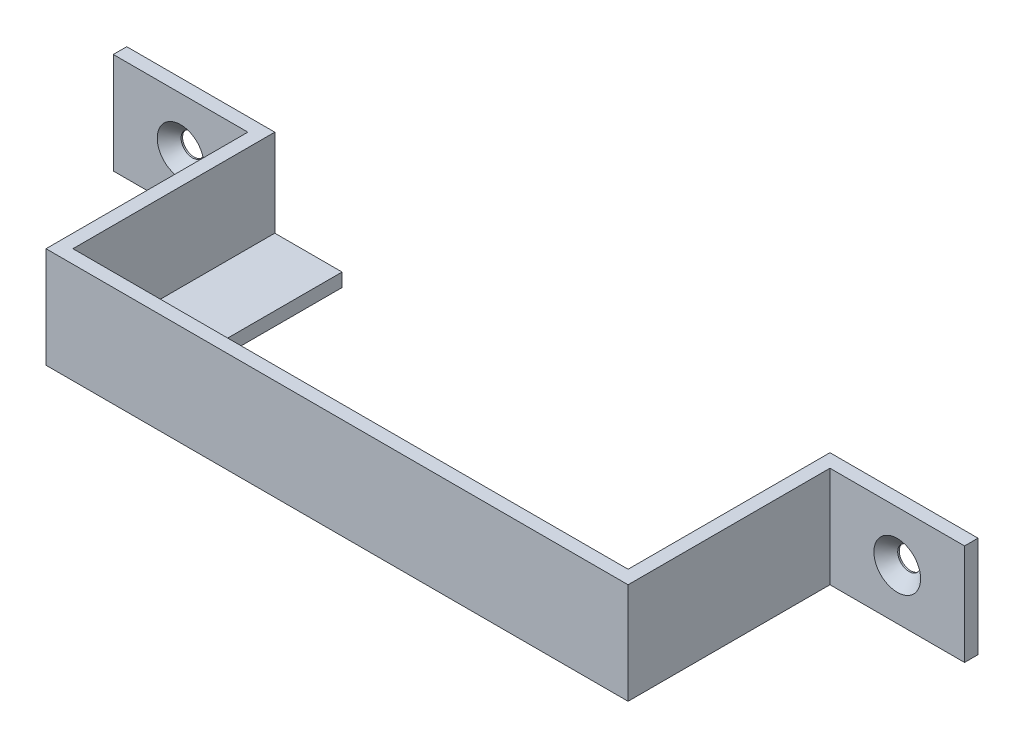
ISO-10303-21;
HEADER;
FILE_DESCRIPTION(('STEP AP214'),'2;1');
FILE_NAME('part.step','',(''),(''),'','','');
FILE_SCHEMA(('AUTOMOTIVE_DESIGN { 1 0 10303 214 1 1 1 1 }'));
ENDSEC;
DATA;
#1=APPLICATION_CONTEXT('core data for automotive mechanical design processes');
#2=APPLICATION_PROTOCOL_DEFINITION('international standard','automotive_design',2000,#1);
#3=PRODUCT_CONTEXT('',#1,'mechanical');
#4=PRODUCT('Part','Part','',(#3));
#5=PRODUCT_RELATED_PRODUCT_CATEGORY('part','',(#4));
#6=PRODUCT_DEFINITION_FORMATION('','',#4);
#7=PRODUCT_DEFINITION_CONTEXT('part definition',#1,'design');
#8=PRODUCT_DEFINITION('design','',#6,#7);
#9=PRODUCT_DEFINITION_SHAPE('','',#8);
#10=(LENGTH_UNIT() NAMED_UNIT(*) SI_UNIT(.MILLI.,.METRE.));
#11=(NAMED_UNIT(*) PLANE_ANGLE_UNIT() SI_UNIT($,.RADIAN.));
#12=(NAMED_UNIT(*) SI_UNIT($,.STERADIAN.) SOLID_ANGLE_UNIT());
#13=UNCERTAINTY_MEASURE_WITH_UNIT(LENGTH_MEASURE(1.E-05),#10,'distance_accuracy_value','');
#14=(GEOMETRIC_REPRESENTATION_CONTEXT(3) GLOBAL_UNCERTAINTY_ASSIGNED_CONTEXT((#13)) GLOBAL_UNIT_ASSIGNED_CONTEXT((#10,
#11,#12)) REPRESENTATION_CONTEXT('',''));
#15=CARTESIAN_POINT('',(0.,0.,0.));
#16=DIRECTION('',(0.,0.,1.));
#17=DIRECTION('',(1.,0.,0.));
#18=AXIS2_PLACEMENT_3D('',#15,#16,#17);
#19=CARTESIAN_POINT('',(104.5,15.,30.));
#20=DIRECTION('',(1.,0.,0.));
#21=DIRECTION('',(0.,0.,-1.));
#22=AXIS2_PLACEMENT_3D('',#19,#20,#21);
#23=PLANE('',#22);
#24=DIRECTION('',(0.,0.,1.));
#25=VECTOR('',#24,1.);
#26=CARTESIAN_POINT('',(104.5,2.,0.));
#27=LINE('',#26,#25);
#28=CARTESIAN_POINT('',(104.5,2.,0.));
#29=VERTEX_POINT('',#28);
#30=CARTESIAN_POINT('',(104.5,2.,30.));
#31=VERTEX_POINT('',#30);
#32=EDGE_CURVE('E61',#29,#31,#27,.T.);
#33=ORIENTED_EDGE('',*,*,#32,.T.);
#34=DIRECTION('',(0.,-1.,0.));
#35=VECTOR('',#34,1.);
#36=CARTESIAN_POINT('',(104.5,15.,30.));
#37=LINE('',#36,#35);
#38=CARTESIAN_POINT('',(104.5,15.,30.));
#39=VERTEX_POINT('',#38);
#40=EDGE_CURVE('E300',#39,#31,#37,.T.);
#41=ORIENTED_EDGE('',*,*,#40,.F.);
#42=DIRECTION('',(0.,0.,1.));
#43=VECTOR('',#42,1.);
#44=CARTESIAN_POINT('',(104.5,15.,30.));
#45=LINE('',#44,#43);
#46=CARTESIAN_POINT('',(104.5,15.,0.));
#47=VERTEX_POINT('',#46);
#48=EDGE_CURVE('E252',#47,#39,#45,.T.);
#49=ORIENTED_EDGE('',*,*,#48,.F.);
#50=DIRECTION('',(0.,-1.,0.));
#51=VECTOR('',#50,1.);
#52=CARTESIAN_POINT('',(104.5,15.,0.));
#53=LINE('',#52,#51);
#54=EDGE_CURVE('E57',#47,#29,#53,.T.);
#55=ORIENTED_EDGE('',*,*,#54,.T.);
#56=EDGE_LOOP('',(#33,#41,#49,#55));
#57=FACE_BOUND('',#56,.T.);
#58=ADVANCED_FACE('F39',(#57),#23,.F.);
#59=CARTESIAN_POINT('',(22.,15.,30.));
#60=DIRECTION('',(0.,0.,1.));
#61=DIRECTION('',(1.,0.,0.));
#62=AXIS2_PLACEMENT_3D('',#59,#60,#61);
#63=PLANE('',#62);
#64=DIRECTION('',(-1.,0.,0.));
#65=VECTOR('',#64,1.);
#66=CARTESIAN_POINT('',(104.5,2.,30.));
#67=LINE('',#66,#65);
#68=CARTESIAN_POINT('',(22.,2.,30.));
#69=VERTEX_POINT('',#68);
#70=EDGE_CURVE('E166',#31,#69,#67,.T.);
#71=ORIENTED_EDGE('',*,*,#70,.T.);
#72=DIRECTION('',(0.,-1.,0.));
#73=VECTOR('',#72,1.);
#74=CARTESIAN_POINT('',(22.,15.,30.));
#75=LINE('',#74,#73);
#76=CARTESIAN_POINT('',(22.,15.,30.));
#77=VERTEX_POINT('',#76);
#78=EDGE_CURVE('E296',#77,#69,#75,.T.);
#79=ORIENTED_EDGE('',*,*,#78,.F.);
#80=DIRECTION('',(-1.,0.,0.));
#81=VECTOR('',#80,1.);
#82=CARTESIAN_POINT('',(22.,15.,30.));
#83=LINE('',#82,#81);
#84=EDGE_CURVE('E255',#39,#77,#83,.T.);
#85=ORIENTED_EDGE('',*,*,#84,.F.);
#86=ORIENTED_EDGE('',*,*,#40,.T.);
#87=EDGE_LOOP('',(#71,#79,#85,#86));
#88=FACE_BOUND('',#87,.T.);
#89=ADVANCED_FACE('F396',(#88),#63,.F.);
#90=CARTESIAN_POINT('',(22.,15.,0.));
#91=DIRECTION('',(-1.,0.,0.));
#92=DIRECTION('',(0.,0.,1.));
#93=AXIS2_PLACEMENT_3D('',#90,#91,#92);
#94=PLANE('',#93);
#95=DIRECTION('',(0.,0.,-1.));
#96=VECTOR('',#95,1.);
#97=CARTESIAN_POINT('',(22.,2.,30.));
#98=LINE('',#97,#96);
#99=CARTESIAN_POINT('',(22.,2.,0.));
#100=VERTEX_POINT('',#99);
#101=EDGE_CURVE('E185',#69,#100,#98,.T.);
#102=ORIENTED_EDGE('',*,*,#101,.T.);
#103=DIRECTION('',(0.,-1.,0.));
#104=VECTOR('',#103,1.);
#105=CARTESIAN_POINT('',(22.,15.,0.));
#106=LINE('',#105,#104);
#107=CARTESIAN_POINT('',(22.,15.,0.));
#108=VERTEX_POINT('',#107);
#109=EDGE_CURVE('E183',#108,#100,#106,.T.);
#110=ORIENTED_EDGE('',*,*,#109,.F.);
#111=DIRECTION('',(0.,0.,-1.));
#112=VECTOR('',#111,1.);
#113=CARTESIAN_POINT('',(22.,15.,0.));
#114=LINE('',#113,#112);
#115=EDGE_CURVE('E258',#77,#108,#114,.T.);
#116=ORIENTED_EDGE('',*,*,#115,.F.);
#117=ORIENTED_EDGE('',*,*,#78,.T.);
#118=EDGE_LOOP('',(#102,#110,#116,#117));
#119=FACE_BOUND('',#118,.T.);
#120=ADVANCED_FACE('F400',(#119),#94,.F.);
#121=CARTESIAN_POINT('',(0.,15.,2.));
#122=DIRECTION('',(1.,0.,0.));
#123=DIRECTION('',(0.,0.,-1.));
#124=AXIS2_PLACEMENT_3D('',#121,#122,#123);
#125=PLANE('',#124);
#126=DIRECTION('',(0.,0.,1.));
#127=VECTOR('',#126,1.);
#128=CARTESIAN_POINT('',(0.,0.,2.));
#129=LINE('',#128,#127);
#130=CARTESIAN_POINT('',(0.,0.,0.));
#131=VERTEX_POINT('',#130);
#132=CARTESIAN_POINT('',(0.,0.,2.));
#133=VERTEX_POINT('',#132);
#134=EDGE_CURVE('E220',#131,#133,#129,.T.);
#135=ORIENTED_EDGE('',*,*,#134,.T.);
#136=DIRECTION('',(0.,-1.,0.));
#137=VECTOR('',#136,1.);
#138=CARTESIAN_POINT('',(0.,15.,2.));
#139=LINE('',#138,#137);
#140=CARTESIAN_POINT('',(0.,15.,2.));
#141=VERTEX_POINT('',#140);
#142=EDGE_CURVE('E11',#141,#133,#139,.T.);
#143=ORIENTED_EDGE('',*,*,#142,.F.);
#144=DIRECTION('',(0.,0.,1.));
#145=VECTOR('',#144,1.);
#146=CARTESIAN_POINT('',(0.,15.,2.));
#147=LINE('',#146,#145);
#148=CARTESIAN_POINT('',(0.,15.,0.));
#149=VERTEX_POINT('',#148);
#150=EDGE_CURVE('E226',#149,#141,#147,.T.);
#151=ORIENTED_EDGE('',*,*,#150,.F.);
#152=DIRECTION('',(0.,-1.,0.));
#153=VECTOR('',#152,1.);
#154=CARTESIAN_POINT('',(0.,15.,0.));
#155=LINE('',#154,#153);
#156=EDGE_CURVE('E264',#149,#131,#155,.T.);
#157=ORIENTED_EDGE('',*,*,#156,.T.);
#158=EDGE_LOOP('',(#135,#143,#151,#157));
#159=FACE_BOUND('',#158,.T.);
#160=ADVANCED_FACE('F41',(#159),#125,.F.);
#161=CARTESIAN_POINT('',(20.,15.,2.));
#162=DIRECTION('',(0.,0.,-1.));
#163=DIRECTION('',(-1.,0.,0.));
#164=AXIS2_PLACEMENT_3D('',#161,#162,#163);
#165=PLANE('',#164);
#166=CARTESIAN_POINT('',(9.99999999999999,7.5,2.));
#167=DIRECTION('',(0.,0.,1.));
#168=DIRECTION('',(1.,0.,0.));
#169=AXIS2_PLACEMENT_3D('',#166,#167,#168);
#170=CIRCLE('',#169,3.47);
#171=CARTESIAN_POINT('',(13.47,7.5,2.));
#172=VERTEX_POINT('',#171);
#173=EDGE_CURVE('E345',#172,#172,#170,.T.);
#174=ORIENTED_EDGE('',*,*,#173,.F.);
#175=EDGE_LOOP('',(#174));
#176=FACE_BOUND('',#175,.T.);
#177=DIRECTION('',(1.,0.,0.));
#178=VECTOR('',#177,1.);
#179=CARTESIAN_POINT('',(20.,0.,2.));
#180=LINE('',#179,#178);
#181=CARTESIAN_POINT('',(20.,0.,2.));
#182=VERTEX_POINT('',#181);
#183=EDGE_CURVE('E268',#133,#182,#180,.T.);
#184=ORIENTED_EDGE('',*,*,#183,.T.);
#185=DIRECTION('',(0.,-1.,0.));
#186=VECTOR('',#185,1.);
#187=CARTESIAN_POINT('',(20.,15.,2.));
#188=LINE('',#187,#186);
#189=CARTESIAN_POINT('',(20.,15.,2.));
#190=VERTEX_POINT('',#189);
#191=EDGE_CURVE('E49',#190,#182,#188,.T.);
#192=ORIENTED_EDGE('',*,*,#191,.F.);
#193=DIRECTION('',(1.,0.,0.));
#194=VECTOR('',#193,1.);
#195=CARTESIAN_POINT('',(20.,15.,2.));
#196=LINE('',#195,#194);
#197=EDGE_CURVE('E230',#141,#190,#196,.T.);
#198=ORIENTED_EDGE('',*,*,#197,.F.);
#199=ORIENTED_EDGE('',*,*,#142,.T.);
#200=EDGE_LOOP('',(#184,#192,#198,#199));
#201=FACE_BOUND('',#200,.T.);
#202=ADVANCED_FACE('F352',(#176,#201),#165,.F.);
#203=CARTESIAN_POINT('',(20.,15.,32.));
#204=DIRECTION('',(1.,0.,0.));
#205=DIRECTION('',(0.,0.,-1.));
#206=AXIS2_PLACEMENT_3D('',#203,#204,#205);
#207=PLANE('',#206);
#208=DIRECTION('',(0.,0.,1.));
#209=VECTOR('',#208,1.);
#210=CARTESIAN_POINT('',(20.,0.,32.));
#211=LINE('',#210,#209);
#212=CARTESIAN_POINT('',(20.,0.,32.));
#213=VERTEX_POINT('',#212);
#214=EDGE_CURVE('E271',#182,#213,#211,.T.);
#215=ORIENTED_EDGE('',*,*,#214,.T.);
#216=DIRECTION('',(0.,-1.,0.));
#217=VECTOR('',#216,1.);
#218=CARTESIAN_POINT('',(20.,15.,32.));
#219=LINE('',#218,#217);
#220=CARTESIAN_POINT('',(20.,15.,32.));
#221=VERTEX_POINT('',#220);
#222=EDGE_CURVE('E321',#221,#213,#219,.T.);
#223=ORIENTED_EDGE('',*,*,#222,.F.);
#224=DIRECTION('',(0.,0.,1.));
#225=VECTOR('',#224,1.);
#226=CARTESIAN_POINT('',(20.,15.,32.));
#227=LINE('',#226,#225);
#228=EDGE_CURVE('E234',#190,#221,#227,.T.);
#229=ORIENTED_EDGE('',*,*,#228,.F.);
#230=ORIENTED_EDGE('',*,*,#191,.T.);
#231=EDGE_LOOP('',(#215,#223,#229,#230));
#232=FACE_BOUND('',#231,.T.);
#233=ADVANCED_FACE('F355',(#232),#207,.F.);
#234=CARTESIAN_POINT('',(106.5,15.,32.));
#235=DIRECTION('',(0.,0.,-1.));
#236=DIRECTION('',(-1.,0.,0.));
#237=AXIS2_PLACEMENT_3D('',#234,#235,#236);
#238=PLANE('',#237);
#239=DIRECTION('',(1.,0.,0.));
#240=VECTOR('',#239,1.);
#241=CARTESIAN_POINT('',(106.5,0.,32.));
#242=LINE('',#241,#240);
#243=CARTESIAN_POINT('',(106.5,0.,32.));
#244=VERTEX_POINT('',#243);
#245=EDGE_CURVE('E274',#213,#244,#242,.T.);
#246=ORIENTED_EDGE('',*,*,#245,.T.);
#247=DIRECTION('',(0.,-1.,0.));
#248=VECTOR('',#247,1.);
#249=CARTESIAN_POINT('',(106.5,15.,32.));
#250=LINE('',#249,#248);
#251=CARTESIAN_POINT('',(106.5,15.,32.));
#252=VERTEX_POINT('',#251);
#253=EDGE_CURVE('E317',#252,#244,#250,.T.);
#254=ORIENTED_EDGE('',*,*,#253,.F.);
#255=DIRECTION('',(1.,0.,0.));
#256=VECTOR('',#255,1.);
#257=CARTESIAN_POINT('',(106.5,15.,32.));
#258=LINE('',#257,#256);
#259=EDGE_CURVE('E237',#221,#252,#258,.T.);
#260=ORIENTED_EDGE('',*,*,#259,.F.);
#261=ORIENTED_EDGE('',*,*,#222,.T.);
#262=EDGE_LOOP('',(#246,#254,#260,#261));
#263=FACE_BOUND('',#262,.T.);
#264=ADVANCED_FACE('F370',(#263),#238,.F.);
#265=CARTESIAN_POINT('',(106.5,15.,2.));
#266=DIRECTION('',(-1.,0.,0.));
#267=DIRECTION('',(0.,0.,1.));
#268=AXIS2_PLACEMENT_3D('',#265,#266,#267);
#269=PLANE('',#268);
#270=DIRECTION('',(0.,0.,-1.));
#271=VECTOR('',#270,1.);
#272=CARTESIAN_POINT('',(106.5,0.,2.));
#273=LINE('',#272,#271);
#274=CARTESIAN_POINT('',(106.5,0.,2.));
#275=VERTEX_POINT('',#274);
#276=EDGE_CURVE('E277',#244,#275,#273,.T.);
#277=ORIENTED_EDGE('',*,*,#276,.T.);
#278=DIRECTION('',(0.,-1.,0.));
#279=VECTOR('',#278,1.);
#280=CARTESIAN_POINT('',(106.5,15.,2.));
#281=LINE('',#280,#279);
#282=CARTESIAN_POINT('',(106.5,15.,2.));
#283=VERTEX_POINT('',#282);
#284=EDGE_CURVE('E313',#283,#275,#281,.T.);
#285=ORIENTED_EDGE('',*,*,#284,.F.);
#286=DIRECTION('',(0.,0.,-1.));
#287=VECTOR('',#286,1.);
#288=CARTESIAN_POINT('',(106.5,15.,2.));
#289=LINE('',#288,#287);
#290=EDGE_CURVE('E240',#252,#283,#289,.T.);
#291=ORIENTED_EDGE('',*,*,#290,.F.);
#292=ORIENTED_EDGE('',*,*,#253,.T.);
#293=EDGE_LOOP('',(#277,#285,#291,#292));
#294=FACE_BOUND('',#293,.T.);
#295=ADVANCED_FACE('F374',(#294),#269,.F.);
#296=CARTESIAN_POINT('',(126.5,15.,2.));
#297=DIRECTION('',(0.,0.,-1.));
#298=DIRECTION('',(-1.,0.,0.));
#299=AXIS2_PLACEMENT_3D('',#296,#297,#298);
#300=PLANE('',#299);
#301=CARTESIAN_POINT('',(116.5,7.5,2.));
#302=DIRECTION('',(0.,0.,1.));
#303=DIRECTION('',(1.,0.,0.));
#304=AXIS2_PLACEMENT_3D('',#301,#302,#303);
#305=CIRCLE('',#304,3.47);
#306=CARTESIAN_POINT('',(119.97,7.5,2.));
#307=VERTEX_POINT('',#306);
#308=EDGE_CURVE('E334',#307,#307,#305,.T.);
#309=ORIENTED_EDGE('',*,*,#308,.F.);
#310=EDGE_LOOP('',(#309));
#311=FACE_BOUND('',#310,.T.);
#312=DIRECTION('',(1.,0.,0.));
#313=VECTOR('',#312,1.);
#314=CARTESIAN_POINT('',(126.5,0.,2.));
#315=LINE('',#314,#313);
#316=CARTESIAN_POINT('',(126.5,0.,2.));
#317=VERTEX_POINT('',#316);
#318=EDGE_CURVE('E280',#275,#317,#315,.T.);
#319=ORIENTED_EDGE('',*,*,#318,.T.);
#320=DIRECTION('',(0.,-1.,0.));
#321=VECTOR('',#320,1.);
#322=CARTESIAN_POINT('',(126.5,15.,2.));
#323=LINE('',#322,#321);
#324=CARTESIAN_POINT('',(126.5,15.,2.));
#325=VERTEX_POINT('',#324);
#326=EDGE_CURVE('E309',#325,#317,#323,.T.);
#327=ORIENTED_EDGE('',*,*,#326,.F.);
#328=DIRECTION('',(1.,0.,0.));
#329=VECTOR('',#328,1.);
#330=CARTESIAN_POINT('',(126.5,15.,2.));
#331=LINE('',#330,#329);
#332=EDGE_CURVE('E243',#283,#325,#331,.T.);
#333=ORIENTED_EDGE('',*,*,#332,.F.);
#334=ORIENTED_EDGE('',*,*,#284,.T.);
#335=EDGE_LOOP('',(#319,#327,#333,#334));
#336=FACE_BOUND('',#335,.T.);
#337=ADVANCED_FACE('F415',(#311,#336),#300,.F.);
#338=CARTESIAN_POINT('',(126.5,15.,0.));
#339=DIRECTION('',(-1.,0.,0.));
#340=DIRECTION('',(0.,0.,1.));
#341=AXIS2_PLACEMENT_3D('',#338,#339,#340);
#342=PLANE('',#341);
#343=DIRECTION('',(0.,0.,-1.));
#344=VECTOR('',#343,1.);
#345=CARTESIAN_POINT('',(126.5,0.,0.));
#346=LINE('',#345,#344);
#347=CARTESIAN_POINT('',(126.5,0.,0.));
#348=VERTEX_POINT('',#347);
#349=EDGE_CURVE('E283',#317,#348,#346,.T.);
#350=ORIENTED_EDGE('',*,*,#349,.T.);
#351=DIRECTION('',(0.,-1.,0.));
#352=VECTOR('',#351,1.);
#353=CARTESIAN_POINT('',(126.5,15.,0.));
#354=LINE('',#353,#352);
#355=CARTESIAN_POINT('',(126.5,15.,0.));
#356=VERTEX_POINT('',#355);
#357=EDGE_CURVE('E305',#356,#348,#354,.T.);
#358=ORIENTED_EDGE('',*,*,#357,.F.);
#359=DIRECTION('',(0.,0.,-1.));
#360=VECTOR('',#359,1.);
#361=CARTESIAN_POINT('',(126.5,15.,0.));
#362=LINE('',#361,#360);
#363=EDGE_CURVE('E246',#325,#356,#362,.T.);
#364=ORIENTED_EDGE('',*,*,#363,.F.);
#365=ORIENTED_EDGE('',*,*,#326,.T.);
#366=EDGE_LOOP('',(#350,#358,#364,#365));
#367=FACE_BOUND('',#366,.T.);
#368=ADVANCED_FACE('F412',(#367),#342,.F.);
#369=CARTESIAN_POINT('',(104.5,15.,0.));
#370=DIRECTION('',(0.,0.,1.));
#371=DIRECTION('',(1.,0.,0.));
#372=AXIS2_PLACEMENT_3D('',#369,#370,#371);
#373=PLANE('',#372);
#374=CARTESIAN_POINT('',(116.5,7.5,0.));
#375=DIRECTION('',(0.,0.,1.));
#376=DIRECTION('',(1.,0.,0.));
#377=AXIS2_PLACEMENT_3D('',#374,#375,#376);
#378=CIRCLE('',#377,1.69999999999999);
#379=CARTESIAN_POINT('',(118.2,7.5,0.));
#380=VERTEX_POINT('',#379);
#381=EDGE_CURVE('E209',#380,#380,#378,.T.);
#382=ORIENTED_EDGE('',*,*,#381,.T.);
#383=EDGE_LOOP('',(#382));
#384=FACE_BOUND('',#383,.T.);
#385=DIRECTION('',(-1.,0.,0.));
#386=VECTOR('',#385,1.);
#387=CARTESIAN_POINT('',(104.5,0.,0.));
#388=LINE('',#387,#386);
#389=CARTESIAN_POINT('',(94.5,0.,0.));
#390=VERTEX_POINT('',#389);
#391=EDGE_CURVE('E286',#348,#390,#388,.T.);
#392=ORIENTED_EDGE('',*,*,#391,.T.);
#393=DIRECTION('',(0.,-1.,0.));
#394=VECTOR('',#393,1.);
#395=CARTESIAN_POINT('',(94.5,2.,0.));
#396=LINE('',#395,#394);
#397=CARTESIAN_POINT('',(94.5,2.,0.));
#398=VERTEX_POINT('',#397);
#399=EDGE_CURVE('E216',#398,#390,#396,.T.);
#400=ORIENTED_EDGE('',*,*,#399,.F.);
#401=DIRECTION('',(1.,0.,0.));
#402=VECTOR('',#401,1.);
#403=CARTESIAN_POINT('',(94.5,2.,0.));
#404=LINE('',#403,#402);
#405=EDGE_CURVE('E198',#398,#29,#404,.T.);
#406=ORIENTED_EDGE('',*,*,#405,.T.);
#407=ORIENTED_EDGE('',*,*,#54,.F.);
#408=DIRECTION('',(-1.,0.,0.));
#409=VECTOR('',#408,1.);
#410=CARTESIAN_POINT('',(104.5,15.,0.));
#411=LINE('',#410,#409);
#412=EDGE_CURVE('E249',#356,#47,#411,.T.);
#413=ORIENTED_EDGE('',*,*,#412,.F.);
#414=ORIENTED_EDGE('',*,*,#357,.T.);
#415=EDGE_LOOP('',(#392,#400,#406,#407,#413,#414));
#416=FACE_BOUND('',#415,.T.);
#417=ADVANCED_FACE('F392',(#384,#416),#373,.F.);
#418=CARTESIAN_POINT('',(0.,15.,0.));
#419=DIRECTION('',(0.,0.,1.));
#420=DIRECTION('',(1.,0.,0.));
#421=AXIS2_PLACEMENT_3D('',#418,#419,#420);
#422=PLANE('',#421);
#423=CARTESIAN_POINT('',(9.99999999999999,7.5,0.));
#424=DIRECTION('',(0.,0.,1.));
#425=DIRECTION('',(1.,0.,0.));
#426=AXIS2_PLACEMENT_3D('',#423,#424,#425);
#427=CIRCLE('',#426,1.7);
#428=CARTESIAN_POINT('',(11.7,7.5,0.));
#429=VERTEX_POINT('',#428);
#430=EDGE_CURVE('E43',#429,#429,#427,.T.);
#431=ORIENTED_EDGE('',*,*,#430,.T.);
#432=EDGE_LOOP('',(#431));
#433=FACE_BOUND('',#432,.T.);
#434=DIRECTION('',(-1.,0.,0.));
#435=VECTOR('',#434,1.);
#436=CARTESIAN_POINT('',(0.,0.,0.));
#437=LINE('',#436,#435);
#438=CARTESIAN_POINT('',(32.,0.,0.));
#439=VERTEX_POINT('',#438);
#440=EDGE_CURVE('E231',#439,#131,#437,.T.);
#441=ORIENTED_EDGE('',*,*,#440,.T.);
#442=ORIENTED_EDGE('',*,*,#156,.F.);
#443=DIRECTION('',(-1.,0.,0.));
#444=VECTOR('',#443,1.);
#445=CARTESIAN_POINT('',(0.,15.,0.));
#446=LINE('',#445,#444);
#447=EDGE_CURVE('E261',#108,#149,#446,.T.);
#448=ORIENTED_EDGE('',*,*,#447,.F.);
#449=ORIENTED_EDGE('',*,*,#109,.T.);
#450=DIRECTION('',(1.,0.,0.));
#451=VECTOR('',#450,1.);
#452=CARTESIAN_POINT('',(22.,2.,0.));
#453=LINE('',#452,#451);
#454=CARTESIAN_POINT('',(32.,2.,0.));
#455=VERTEX_POINT('',#454);
#456=EDGE_CURVE('E173',#100,#455,#453,.T.);
#457=ORIENTED_EDGE('',*,*,#456,.T.);
#458=DIRECTION('',(0.,-1.,0.));
#459=VECTOR('',#458,1.);
#460=CARTESIAN_POINT('',(32.,2.,0.));
#461=LINE('',#460,#459);
#462=EDGE_CURVE('E156',#455,#439,#461,.T.);
#463=ORIENTED_EDGE('',*,*,#462,.T.);
#464=EDGE_LOOP('',(#441,#442,#448,#449,#457,#463));
#465=FACE_BOUND('',#464,.T.);
#466=ADVANCED_FACE('F180',(#433,#465),#422,.F.);
#467=CARTESIAN_POINT('',(0.,15.,0.));
#468=DIRECTION('',(0.,-1.,0.));
#469=DIRECTION('',(0.,0.,-1.));
#470=AXIS2_PLACEMENT_3D('',#467,#468,#469);
#471=PLANE('',#470);
#472=ORIENTED_EDGE('',*,*,#150,.T.);
#473=ORIENTED_EDGE('',*,*,#197,.T.);
#474=ORIENTED_EDGE('',*,*,#228,.T.);
#475=ORIENTED_EDGE('',*,*,#259,.T.);
#476=ORIENTED_EDGE('',*,*,#290,.T.);
#477=ORIENTED_EDGE('',*,*,#332,.T.);
#478=ORIENTED_EDGE('',*,*,#363,.T.);
#479=ORIENTED_EDGE('',*,*,#412,.T.);
#480=ORIENTED_EDGE('',*,*,#48,.T.);
#481=ORIENTED_EDGE('',*,*,#84,.T.);
#482=ORIENTED_EDGE('',*,*,#115,.T.);
#483=ORIENTED_EDGE('',*,*,#447,.T.);
#484=EDGE_LOOP('',(#472,#473,#474,#475,#476,#477,#478,#479,#480,#481,#482,#483));
#485=FACE_BOUND('',#484,.T.);
#486=ADVANCED_FACE('F378',(#485),#471,.F.);
#487=CARTESIAN_POINT('',(0.,0.,0.));
#488=DIRECTION('',(0.,-1.,0.));
#489=DIRECTION('',(0.,0.,-1.));
#490=AXIS2_PLACEMENT_3D('',#487,#488,#489);
#491=PLANE('',#490);
#492=ORIENTED_EDGE('',*,*,#440,.F.);
#493=DIRECTION('',(0.,0.,1.));
#494=VECTOR('',#493,1.);
#495=CARTESIAN_POINT('',(32.,0.,0.));
#496=LINE('',#495,#494);
#497=CARTESIAN_POINT('',(32.,0.,25.));
#498=VERTEX_POINT('',#497);
#499=EDGE_CURVE('E161',#439,#498,#496,.T.);
#500=ORIENTED_EDGE('',*,*,#499,.T.);
#501=DIRECTION('',(1.,0.,0.));
#502=VECTOR('',#501,1.);
#503=CARTESIAN_POINT('',(32.,0.,25.));
#504=LINE('',#503,#502);
#505=CARTESIAN_POINT('',(94.5,0.,25.));
#506=VERTEX_POINT('',#505);
#507=EDGE_CURVE('E208',#498,#506,#504,.T.);
#508=ORIENTED_EDGE('',*,*,#507,.T.);
#509=DIRECTION('',(0.,0.,-1.));
#510=VECTOR('',#509,1.);
#511=CARTESIAN_POINT('',(94.5,0.,25.));
#512=LINE('',#511,#510);
#513=EDGE_CURVE('E188',#506,#390,#512,.T.);
#514=ORIENTED_EDGE('',*,*,#513,.T.);
#515=ORIENTED_EDGE('',*,*,#391,.F.);
#516=ORIENTED_EDGE('',*,*,#349,.F.);
#517=ORIENTED_EDGE('',*,*,#318,.F.);
#518=ORIENTED_EDGE('',*,*,#276,.F.);
#519=ORIENTED_EDGE('',*,*,#245,.F.);
#520=ORIENTED_EDGE('',*,*,#214,.F.);
#521=ORIENTED_EDGE('',*,*,#183,.F.);
#522=ORIENTED_EDGE('',*,*,#134,.F.);
#523=EDGE_LOOP('',(#492,#500,#508,#514,#515,#516,#517,#518,#519,#520,#521,#522));
#524=FACE_BOUND('',#523,.T.);
#525=ADVANCED_FACE('F365',(#524),#491,.T.);
#526=CARTESIAN_POINT('',(94.5,2.,25.));
#527=DIRECTION('',(-1.,0.,0.));
#528=DIRECTION('',(0.,0.,1.));
#529=AXIS2_PLACEMENT_3D('',#526,#527,#528);
#530=PLANE('',#529);
#531=ORIENTED_EDGE('',*,*,#513,.F.);
#532=DIRECTION('',(0.,-1.,0.));
#533=VECTOR('',#532,1.);
#534=CARTESIAN_POINT('',(94.5,2.,25.));
#535=LINE('',#534,#533);
#536=CARTESIAN_POINT('',(94.5,2.,25.));
#537=VERTEX_POINT('',#536);
#538=EDGE_CURVE('E221',#537,#506,#535,.T.);
#539=ORIENTED_EDGE('',*,*,#538,.F.);
#540=DIRECTION('',(0.,0.,-1.));
#541=VECTOR('',#540,1.);
#542=CARTESIAN_POINT('',(94.5,2.,25.));
#543=LINE('',#542,#541);
#544=EDGE_CURVE('E194',#537,#398,#543,.T.);
#545=ORIENTED_EDGE('',*,*,#544,.T.);
#546=ORIENTED_EDGE('',*,*,#399,.T.);
#547=EDGE_LOOP('',(#531,#539,#545,#546));
#548=FACE_BOUND('',#547,.T.);
#549=ADVANCED_FACE('F389',(#548),#530,.T.);
#550=CARTESIAN_POINT('',(32.,2.,25.));
#551=DIRECTION('',(0.,0.,-1.));
#552=DIRECTION('',(-1.,0.,0.));
#553=AXIS2_PLACEMENT_3D('',#550,#551,#552);
#554=PLANE('',#553);
#555=ORIENTED_EDGE('',*,*,#507,.F.);
#556=DIRECTION('',(0.,-1.,0.));
#557=VECTOR('',#556,1.);
#558=CARTESIAN_POINT('',(32.,2.,25.));
#559=LINE('',#558,#557);
#560=CARTESIAN_POINT('',(32.,2.,25.));
#561=VERTEX_POINT('',#560);
#562=EDGE_CURVE('E165',#561,#498,#559,.T.);
#563=ORIENTED_EDGE('',*,*,#562,.F.);
#564=DIRECTION('',(1.,0.,0.));
#565=VECTOR('',#564,1.);
#566=CARTESIAN_POINT('',(32.,2.,25.));
#567=LINE('',#566,#565);
#568=EDGE_CURVE('E176',#561,#537,#567,.T.);
#569=ORIENTED_EDGE('',*,*,#568,.T.);
#570=ORIENTED_EDGE('',*,*,#538,.T.);
#571=EDGE_LOOP('',(#555,#563,#569,#570));
#572=FACE_BOUND('',#571,.T.);
#573=ADVANCED_FACE('F387',(#572),#554,.T.);
#574=CARTESIAN_POINT('',(32.,2.,0.));
#575=DIRECTION('',(1.,0.,0.));
#576=DIRECTION('',(0.,0.,-1.));
#577=AXIS2_PLACEMENT_3D('',#574,#575,#576);
#578=PLANE('',#577);
#579=ORIENTED_EDGE('',*,*,#499,.F.);
#580=ORIENTED_EDGE('',*,*,#462,.F.);
#581=DIRECTION('',(0.,0.,1.));
#582=VECTOR('',#581,1.);
#583=CARTESIAN_POINT('',(32.,2.,0.));
#584=LINE('',#583,#582);
#585=EDGE_CURVE('E159',#455,#561,#584,.T.);
#586=ORIENTED_EDGE('',*,*,#585,.T.);
#587=ORIENTED_EDGE('',*,*,#562,.T.);
#588=EDGE_LOOP('',(#579,#580,#586,#587));
#589=FACE_BOUND('',#588,.T.);
#590=ADVANCED_FACE('F158',(#589),#578,.T.);
#591=CARTESIAN_POINT('',(0.,2.,0.));
#592=DIRECTION('',(0.,-1.,0.));
#593=DIRECTION('',(0.,0.,-1.));
#594=AXIS2_PLACEMENT_3D('',#591,#592,#593);
#595=PLANE('',#594);
#596=ORIENTED_EDGE('',*,*,#101,.F.);
#597=ORIENTED_EDGE('',*,*,#70,.F.);
#598=ORIENTED_EDGE('',*,*,#32,.F.);
#599=ORIENTED_EDGE('',*,*,#405,.F.);
#600=ORIENTED_EDGE('',*,*,#544,.F.);
#601=ORIENTED_EDGE('',*,*,#568,.F.);
#602=ORIENTED_EDGE('',*,*,#585,.F.);
#603=ORIENTED_EDGE('',*,*,#456,.F.);
#604=EDGE_LOOP('',(#596,#597,#598,#599,#600,#601,#602,#603));
#605=FACE_BOUND('',#604,.T.);
#606=ADVANCED_FACE('F172',(#605),#595,.F.);
#607=CARTESIAN_POINT('',(116.5,7.5,2.));
#608=DIRECTION('',(0.,0.,1.));
#609=DIRECTION('',(1.,0.,0.));
#610=AXIS2_PLACEMENT_3D('',#607,#608,#609);
#611=CYLINDRICAL_SURFACE('',#610,1.69999999999999);
#612=CARTESIAN_POINT('',(116.5,7.5,0.229999999999999));
#613=DIRECTION('',(0.,0.,1.));
#614=DIRECTION('',(1.,0.,0.));
#615=AXIS2_PLACEMENT_3D('',#612,#613,#614);
#616=CIRCLE('',#615,1.69999999999999);
#617=CARTESIAN_POINT('',(118.2,7.5,0.229999999999999));
#618=VERTEX_POINT('',#617);
#619=EDGE_CURVE('E329',#618,#618,#616,.T.);
#620=ORIENTED_EDGE('',*,*,#619,.T.);
#621=EDGE_LOOP('',(#620));
#622=FACE_BOUND('',#621,.T.);
#623=ORIENTED_EDGE('',*,*,#381,.F.);
#624=EDGE_LOOP('',(#623));
#625=FACE_BOUND('',#624,.T.);
#626=ADVANCED_FACE('F496',(#622,#625),#611,.F.);
#627=CARTESIAN_POINT('',(116.5,7.5,2.));
#628=DIRECTION('',(0.,0.,1.));
#629=DIRECTION('',(1.,0.,0.));
#630=AXIS2_PLACEMENT_3D('',#627,#628,#629);
#631=CONICAL_SURFACE('',#630,3.47,0.78539816339745);
#632=ORIENTED_EDGE('',*,*,#619,.F.);
#633=EDGE_LOOP('',(#632));
#634=FACE_BOUND('',#633,.T.);
#635=ORIENTED_EDGE('',*,*,#308,.T.);
#636=EDGE_LOOP('',(#635));
#637=FACE_BOUND('',#636,.T.);
#638=ADVANCED_FACE('F502',(#634,#637),#631,.F.);
#639=CARTESIAN_POINT('',(9.99999999999999,7.5,2.));
#640=DIRECTION('',(0.,0.,1.));
#641=DIRECTION('',(1.,0.,0.));
#642=AXIS2_PLACEMENT_3D('',#639,#640,#641);
#643=CYLINDRICAL_SURFACE('',#642,1.7);
#644=CARTESIAN_POINT('',(9.99999999999999,7.5,0.229999999999999));
#645=DIRECTION('',(0.,0.,1.));
#646=DIRECTION('',(1.,0.,0.));
#647=AXIS2_PLACEMENT_3D('',#644,#645,#646);
#648=CIRCLE('',#647,1.7);
#649=CARTESIAN_POINT('',(11.7,7.5,0.229999999999999));
#650=VERTEX_POINT('',#649);
#651=EDGE_CURVE('E341',#650,#650,#648,.T.);
#652=ORIENTED_EDGE('',*,*,#651,.T.);
#653=EDGE_LOOP('',(#652));
#654=FACE_BOUND('',#653,.T.);
#655=ORIENTED_EDGE('',*,*,#430,.F.);
#656=EDGE_LOOP('',(#655));
#657=FACE_BOUND('',#656,.T.);
#658=ADVANCED_FACE('F509',(#654,#657),#643,.F.);
#659=CARTESIAN_POINT('',(9.99999999999999,7.5,2.));
#660=DIRECTION('',(0.,0.,1.));
#661=DIRECTION('',(1.,0.,0.));
#662=AXIS2_PLACEMENT_3D('',#659,#660,#661);
#663=CONICAL_SURFACE('',#662,3.47,0.785398163397449);
#664=ORIENTED_EDGE('',*,*,#651,.F.);
#665=EDGE_LOOP('',(#664));
#666=FACE_BOUND('',#665,.T.);
#667=ORIENTED_EDGE('',*,*,#173,.T.);
#668=EDGE_LOOP('',(#667));
#669=FACE_BOUND('',#668,.T.);
#670=ADVANCED_FACE('F350',(#666,#669),#663,.F.);
#671=CLOSED_SHELL('',(#58,#89,#120,#160,#202,#233,#264,#295,#337,#368,#417,#466,#486,#525,#549,
#573,#590,#606,#626,#638,#658,#670));
#672=MANIFOLD_SOLID_BREP('B2',#671);
#673=ADVANCED_BREP_SHAPE_REPRESENTATION('',(#18,#672),#14);
#674=SHAPE_DEFINITION_REPRESENTATION(#9,#673);
ENDSEC;
END-ISO-10303-21;
